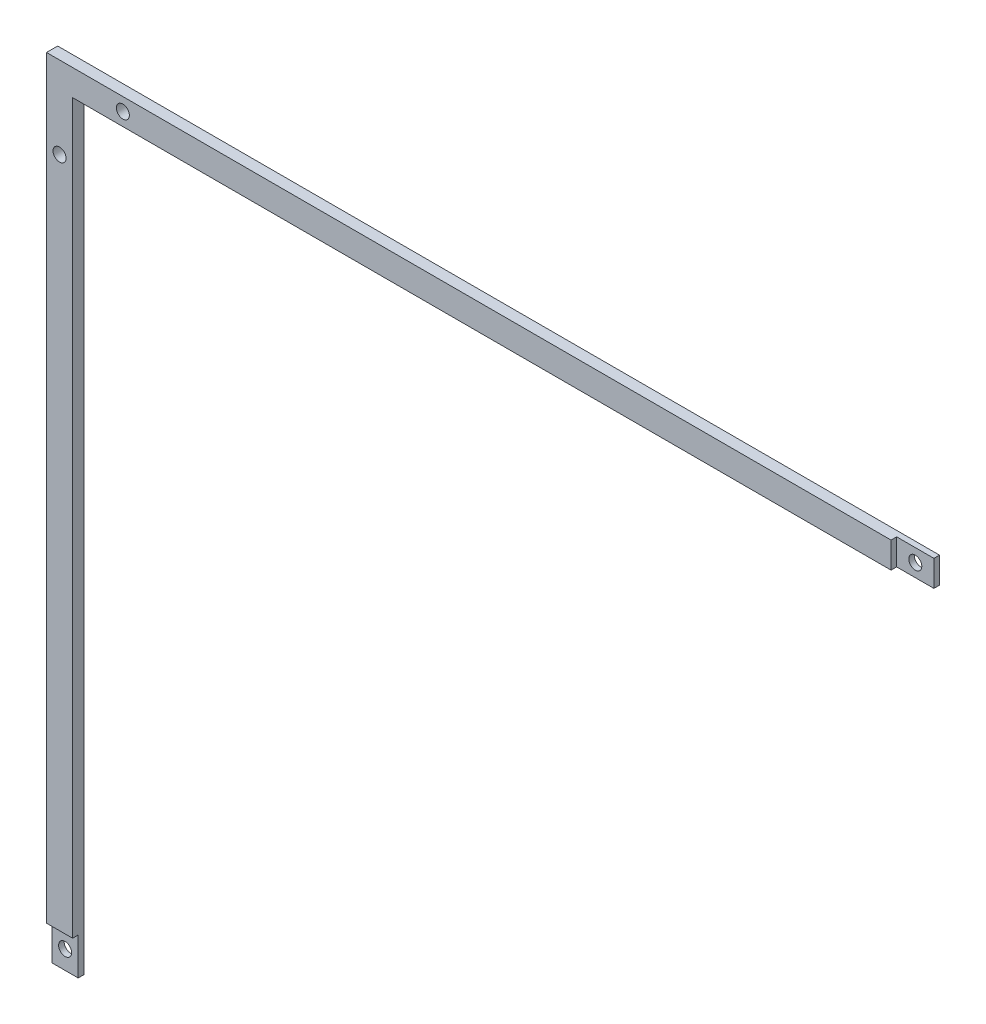
ISO-10303-21;
HEADER;
FILE_DESCRIPTION(('STEP AP214'),'2;1');
FILE_NAME('part.step','',(''),(''),'','','');
FILE_SCHEMA(('AUTOMOTIVE_DESIGN { 1 0 10303 214 1 1 1 1 }'));
ENDSEC;
DATA;
#1=APPLICATION_CONTEXT('core data for automotive mechanical design processes');
#2=APPLICATION_PROTOCOL_DEFINITION('international standard','automotive_design',2000,#1);
#3=PRODUCT_CONTEXT('',#1,'mechanical');
#4=PRODUCT('Part','Part','',(#3));
#5=PRODUCT_RELATED_PRODUCT_CATEGORY('part','',(#4));
#6=PRODUCT_DEFINITION_FORMATION('','',#4);
#7=PRODUCT_DEFINITION_CONTEXT('part definition',#1,'design');
#8=PRODUCT_DEFINITION('design','',#6,#7);
#9=PRODUCT_DEFINITION_SHAPE('','',#8);
#10=(LENGTH_UNIT() NAMED_UNIT(*) SI_UNIT(.MILLI.,.METRE.));
#11=(NAMED_UNIT(*) PLANE_ANGLE_UNIT() SI_UNIT($,.RADIAN.));
#12=(NAMED_UNIT(*) SI_UNIT($,.STERADIAN.) SOLID_ANGLE_UNIT());
#13=UNCERTAINTY_MEASURE_WITH_UNIT(LENGTH_MEASURE(1.E-05),#10,'distance_accuracy_value','');
#14=(GEOMETRIC_REPRESENTATION_CONTEXT(3) GLOBAL_UNCERTAINTY_ASSIGNED_CONTEXT((#13)) GLOBAL_UNIT_ASSIGNED_CONTEXT((#10,
#11,#12)) REPRESENTATION_CONTEXT('',''));
#15=CARTESIAN_POINT('',(0.,0.,0.));
#16=DIRECTION('',(0.,0.,1.));
#17=DIRECTION('',(1.,0.,0.));
#18=AXIS2_PLACEMENT_3D('',#15,#16,#17);
#19=CARTESIAN_POINT('',(483.811741117372,-329.480180132003,3.));
#20=DIRECTION('',(0.,1.,0.));
#21=DIRECTION('',(-1.,0.,0.));
#22=AXIS2_PLACEMENT_3D('',#19,#20,#21);
#23=PLANE('',#22);
#24=DIRECTION('',(1.,0.,0.));
#25=VECTOR('',#24,1.);
#26=CARTESIAN_POINT('',(483.811741117372,-329.480180132003,1.5));
#27=LINE('',#26,#25);
#28=CARTESIAN_POINT('',(483.811741117372,-329.480180132003,1.5));
#29=VERTEX_POINT('',#28);
#30=CARTESIAN_POINT('',(490.811741117372,-329.480180132003,1.5));
#31=VERTEX_POINT('',#30);
#32=EDGE_CURVE('E54',#29,#31,#27,.T.);
#33=ORIENTED_EDGE('',*,*,#32,.F.);
#34=DIRECTION('',(0.,0.,-1.));
#35=VECTOR('',#34,1.);
#36=CARTESIAN_POINT('',(483.811741117372,-329.480180132003,3.));
#37=LINE('',#36,#35);
#38=CARTESIAN_POINT('',(483.811741117372,-329.480180132003,0.));
#39=VERTEX_POINT('',#38);
#40=EDGE_CURVE('E47',#29,#39,#37,.T.);
#41=ORIENTED_EDGE('',*,*,#40,.T.);
#42=DIRECTION('',(1.,0.,0.));
#43=VECTOR('',#42,1.);
#44=CARTESIAN_POINT('',(483.811741117372,-329.480180132003,0.));
#45=LINE('',#44,#43);
#46=CARTESIAN_POINT('',(490.811741117372,-329.480180132003,0.));
#47=VERTEX_POINT('',#46);
#48=EDGE_CURVE('E154',#39,#47,#45,.T.);
#49=ORIENTED_EDGE('',*,*,#48,.T.);
#50=DIRECTION('',(0.,0.,-1.));
#51=VECTOR('',#50,1.);
#52=CARTESIAN_POINT('',(490.811741117372,-329.480180132003,3.));
#53=LINE('',#52,#51);
#54=EDGE_CURVE('E129',#31,#47,#53,.T.);
#55=ORIENTED_EDGE('',*,*,#54,.F.);
#56=EDGE_LOOP('',(#33,#41,#49,#55));
#57=FACE_BOUND('',#56,.T.);
#58=ADVANCED_FACE('F39',(#57),#23,.F.);
#59=CARTESIAN_POINT('',(487.311741117372,-324.480180132003,3.));
#60=DIRECTION('',(0.,0.,-1.));
#61=DIRECTION('',(-1.,0.,0.));
#62=AXIS2_PLACEMENT_3D('',#59,#60,#61);
#63=CYLINDRICAL_SURFACE('',#62,1.74999999999998);
#64=CARTESIAN_POINT('',(487.311741117372,-324.480180132003,0.));
#65=DIRECTION('',(0.,0.,1.));
#66=DIRECTION('',(1.,0.,0.));
#67=AXIS2_PLACEMENT_3D('',#64,#65,#66);
#68=CIRCLE('',#67,1.74999999999998);
#69=CARTESIAN_POINT('',(489.061741117372,-324.480180132003,0.));
#70=VERTEX_POINT('',#69);
#71=EDGE_CURVE('E178',#70,#70,#68,.T.);
#72=ORIENTED_EDGE('',*,*,#71,.F.);
#73=EDGE_LOOP('',(#72));
#74=FACE_BOUND('',#73,.T.);
#75=CARTESIAN_POINT('',(487.311741117372,-324.480180132003,1.5));
#76=DIRECTION('',(0.,0.,1.));
#77=DIRECTION('',(1.,0.,0.));
#78=AXIS2_PLACEMENT_3D('',#75,#76,#77);
#79=CIRCLE('',#78,1.74999999999998);
#80=CARTESIAN_POINT('',(489.061741117372,-324.480180132003,1.5));
#81=VERTEX_POINT('',#80);
#82=EDGE_CURVE('E190',#81,#81,#79,.T.);
#83=ORIENTED_EDGE('',*,*,#82,.T.);
#84=EDGE_LOOP('',(#83));
#85=FACE_BOUND('',#84,.T.);
#86=ADVANCED_FACE('F215',(#74,#85),#63,.F.);
#87=CARTESIAN_POINT('',(0.,0.,3.));
#88=DIRECTION('',(0.,0.,1.));
#89=DIRECTION('',(1.,0.,0.));
#90=AXIS2_PLACEMENT_3D('',#87,#88,#89);
#91=PLANE('',#90);
#92=DIRECTION('',(-1.,0.,0.));
#93=VECTOR('',#92,1.);
#94=CARTESIAN_POINT('',(490.811741117372,-319.480180132003,3.));
#95=LINE('',#94,#93);
#96=CARTESIAN_POINT('',(490.811741117372,-319.480180132003,3.));
#97=VERTEX_POINT('',#96);
#98=CARTESIAN_POINT('',(483.811741117372,-319.480180132003,3.));
#99=VERTEX_POINT('',#98);
#100=EDGE_CURVE('E123',#97,#99,#95,.T.);
#101=ORIENTED_EDGE('',*,*,#100,.F.);
#102=DIRECTION('',(0.,1.,0.));
#103=VECTOR('',#102,1.);
#104=CARTESIAN_POINT('',(490.811741117372,-329.480180132003,3.));
#105=LINE('',#104,#103);
#106=CARTESIAN_POINT('',(490.811741117373,-123.980180132003,3.));
#107=VERTEX_POINT('',#106);
#108=EDGE_CURVE('E163',#97,#107,#105,.T.);
#109=ORIENTED_EDGE('',*,*,#108,.T.);
#110=DIRECTION('',(1.,0.,0.));
#111=VECTOR('',#110,1.);
#112=CARTESIAN_POINT('',(490.811741117373,-123.980180132003,3.));
#113=LINE('',#112,#111);
#114=CARTESIAN_POINT('',(710.611741117373,-123.980180132003,3.));
#115=VERTEX_POINT('',#114);
#116=EDGE_CURVE('E144',#107,#115,#113,.T.);
#117=ORIENTED_EDGE('',*,*,#116,.T.);
#118=DIRECTION('',(0.,-1.,0.));
#119=VECTOR('',#118,1.);
#120=CARTESIAN_POINT('',(710.611741117373,-123.980180132003,3.));
#121=LINE('',#120,#119);
#122=CARTESIAN_POINT('',(710.611741117373,-116.980180132003,3.));
#123=VERTEX_POINT('',#122);
#124=EDGE_CURVE('E191',#123,#115,#121,.T.);
#125=ORIENTED_EDGE('',*,*,#124,.F.);
#126=DIRECTION('',(-1.,0.,0.));
#127=VECTOR('',#126,1.);
#128=CARTESIAN_POINT('',(720.611741117373,-116.980180132003,3.));
#129=LINE('',#128,#127);
#130=CARTESIAN_POINT('',(483.811741117372,-116.980180132003,3.));
#131=VERTEX_POINT('',#130);
#132=EDGE_CURVE('E148',#123,#131,#129,.T.);
#133=ORIENTED_EDGE('',*,*,#132,.T.);
#134=DIRECTION('',(0.,-1.,0.));
#135=VECTOR('',#134,1.);
#136=CARTESIAN_POINT('',(483.811741117372,-116.980180132003,3.));
#137=LINE('',#136,#135);
#138=EDGE_CURVE('E165',#131,#99,#137,.T.);
#139=ORIENTED_EDGE('',*,*,#138,.T.);
#140=EDGE_LOOP('',(#101,#109,#117,#125,#133,#139));
#141=FACE_BOUND('',#140,.T.);
#142=CARTESIAN_POINT('',(504.311741117373,-120.480180132003,3.));
#143=DIRECTION('',(0.,0.,1.));
#144=DIRECTION('',(1.,0.,0.));
#145=AXIS2_PLACEMENT_3D('',#142,#143,#144);
#146=CIRCLE('',#145,1.74999999999999);
#147=CARTESIAN_POINT('',(506.061741117373,-120.480180132003,3.));
#148=VERTEX_POINT('',#147);
#149=EDGE_CURVE('E160',#148,#148,#146,.T.);
#150=ORIENTED_EDGE('',*,*,#149,.F.);
#151=EDGE_LOOP('',(#150));
#152=FACE_BOUND('',#151,.T.);
#153=CARTESIAN_POINT('',(487.311741117372,-138.980180132003,3.));
#154=DIRECTION('',(0.,0.,1.));
#155=DIRECTION('',(1.,0.,0.));
#156=AXIS2_PLACEMENT_3D('',#153,#154,#155);
#157=CIRCLE('',#156,1.74999999999998);
#158=CARTESIAN_POINT('',(489.061741117372,-138.980180132003,3.));
#159=VERTEX_POINT('',#158);
#160=EDGE_CURVE('E172',#159,#159,#157,.T.);
#161=ORIENTED_EDGE('',*,*,#160,.F.);
#162=EDGE_LOOP('',(#161));
#163=FACE_BOUND('',#162,.T.);
#164=ADVANCED_FACE('F232',(#141,#152,#163),#91,.T.);
#165=CARTESIAN_POINT('',(0.,0.,0.));
#166=DIRECTION('',(0.,0.,1.));
#167=DIRECTION('',(1.,0.,0.));
#168=AXIS2_PLACEMENT_3D('',#165,#166,#167);
#169=PLANE('',#168);
#170=DIRECTION('',(-1.,0.,0.));
#171=VECTOR('',#170,1.);
#172=CARTESIAN_POINT('',(720.611741117373,-116.980180132003,0.));
#173=LINE('',#172,#171);
#174=CARTESIAN_POINT('',(720.611741117373,-116.980180132003,0.));
#175=VERTEX_POINT('',#174);
#176=CARTESIAN_POINT('',(483.811741117372,-116.980180132003,0.));
#177=VERTEX_POINT('',#176);
#178=EDGE_CURVE('E157',#175,#177,#173,.T.);
#179=ORIENTED_EDGE('',*,*,#178,.F.);
#180=DIRECTION('',(0.,1.,0.));
#181=VECTOR('',#180,1.);
#182=CARTESIAN_POINT('',(720.611741117373,-123.980180132003,0.));
#183=LINE('',#182,#181);
#184=CARTESIAN_POINT('',(720.611741117373,-123.980180132003,0.));
#185=VERTEX_POINT('',#184);
#186=EDGE_CURVE('E145',#185,#175,#183,.T.);
#187=ORIENTED_EDGE('',*,*,#186,.F.);
#188=DIRECTION('',(1.,0.,0.));
#189=VECTOR('',#188,1.);
#190=CARTESIAN_POINT('',(490.811741117373,-123.980180132003,0.));
#191=LINE('',#190,#189);
#192=CARTESIAN_POINT('',(490.811741117373,-123.980180132003,0.));
#193=VERTEX_POINT('',#192);
#194=EDGE_CURVE('E149',#193,#185,#191,.T.);
#195=ORIENTED_EDGE('',*,*,#194,.F.);
#196=DIRECTION('',(0.,1.,0.));
#197=VECTOR('',#196,1.);
#198=CARTESIAN_POINT('',(490.811741117372,-329.480180132003,0.));
#199=LINE('',#198,#197);
#200=EDGE_CURVE('E152',#47,#193,#199,.T.);
#201=ORIENTED_EDGE('',*,*,#200,.F.);
#202=ORIENTED_EDGE('',*,*,#48,.F.);
#203=DIRECTION('',(0.,-1.,0.));
#204=VECTOR('',#203,1.);
#205=CARTESIAN_POINT('',(483.811741117372,-116.980180132003,0.));
#206=LINE('',#205,#204);
#207=EDGE_CURVE('E133',#177,#39,#206,.T.);
#208=ORIENTED_EDGE('',*,*,#207,.F.);
#209=EDGE_LOOP('',(#179,#187,#195,#201,#202,#208));
#210=FACE_BOUND('',#209,.T.);
#211=CARTESIAN_POINT('',(504.311741117373,-120.480180132003,0.));
#212=DIRECTION('',(0.,0.,1.));
#213=DIRECTION('',(1.,0.,0.));
#214=AXIS2_PLACEMENT_3D('',#211,#212,#213);
#215=CIRCLE('',#214,1.74999999999999);
#216=CARTESIAN_POINT('',(506.061741117373,-120.480180132003,0.));
#217=VERTEX_POINT('',#216);
#218=EDGE_CURVE('E169',#217,#217,#215,.T.);
#219=ORIENTED_EDGE('',*,*,#218,.T.);
#220=EDGE_LOOP('',(#219));
#221=FACE_BOUND('',#220,.T.);
#222=CARTESIAN_POINT('',(487.311741117372,-138.980180132003,0.));
#223=DIRECTION('',(0.,0.,1.));
#224=DIRECTION('',(1.,0.,0.));
#225=AXIS2_PLACEMENT_3D('',#222,#223,#224);
#226=CIRCLE('',#225,1.74999999999998);
#227=CARTESIAN_POINT('',(489.061741117372,-138.980180132003,0.));
#228=VERTEX_POINT('',#227);
#229=EDGE_CURVE('E175',#228,#228,#226,.T.);
#230=ORIENTED_EDGE('',*,*,#229,.T.);
#231=EDGE_LOOP('',(#230));
#232=FACE_BOUND('',#231,.T.);
#233=ORIENTED_EDGE('',*,*,#71,.T.);
#234=EDGE_LOOP('',(#233));
#235=FACE_BOUND('',#234,.T.);
#236=CARTESIAN_POINT('',(715.611741117373,-120.480180132003,0.));
#237=DIRECTION('',(0.,0.,1.));
#238=DIRECTION('',(1.,0.,0.));
#239=AXIS2_PLACEMENT_3D('',#236,#237,#238);
#240=CIRCLE('',#239,1.74999999999999);
#241=CARTESIAN_POINT('',(717.361741117373,-120.480180132003,0.));
#242=VERTEX_POINT('',#241);
#243=EDGE_CURVE('E183',#242,#242,#240,.T.);
#244=ORIENTED_EDGE('',*,*,#243,.T.);
#245=EDGE_LOOP('',(#244));
#246=FACE_BOUND('',#245,.T.);
#247=ADVANCED_FACE('F245',(#210,#221,#232,#235,#246),#169,.F.);
#248=CARTESIAN_POINT('',(720.611741117373,-116.980180132003,3.));
#249=DIRECTION('',(0.,-1.,0.));
#250=DIRECTION('',(1.,0.,0.));
#251=AXIS2_PLACEMENT_3D('',#248,#249,#250);
#252=PLANE('',#251);
#253=ORIENTED_EDGE('',*,*,#132,.F.);
#254=DIRECTION('',(0.,0.,1.));
#255=VECTOR('',#254,1.);
#256=CARTESIAN_POINT('',(710.611741117373,-116.980180132003,1.5));
#257=LINE('',#256,#255);
#258=CARTESIAN_POINT('',(710.611741117373,-116.980180132003,1.5));
#259=VERTEX_POINT('',#258);
#260=EDGE_CURVE('E200',#259,#123,#257,.T.);
#261=ORIENTED_EDGE('',*,*,#260,.F.);
#262=DIRECTION('',(-1.,0.,0.));
#263=VECTOR('',#262,1.);
#264=CARTESIAN_POINT('',(710.611741117373,-116.980180132003,1.5));
#265=LINE('',#264,#263);
#266=CARTESIAN_POINT('',(720.611741117373,-116.980180132003,1.5));
#267=VERTEX_POINT('',#266);
#268=EDGE_CURVE('E192',#267,#259,#265,.T.);
#269=ORIENTED_EDGE('',*,*,#268,.F.);
#270=DIRECTION('',(0.,0.,-1.));
#271=VECTOR('',#270,1.);
#272=CARTESIAN_POINT('',(720.611741117373,-116.980180132003,3.));
#273=LINE('',#272,#271);
#274=EDGE_CURVE('E142',#267,#175,#273,.T.);
#275=ORIENTED_EDGE('',*,*,#274,.T.);
#276=ORIENTED_EDGE('',*,*,#178,.T.);
#277=DIRECTION('',(0.,0.,-1.));
#278=VECTOR('',#277,1.);
#279=CARTESIAN_POINT('',(483.811741117372,-116.980180132003,3.));
#280=LINE('',#279,#278);
#281=EDGE_CURVE('E11',#131,#177,#280,.T.);
#282=ORIENTED_EDGE('',*,*,#281,.F.);
#283=EDGE_LOOP('',(#253,#261,#269,#275,#276,#282));
#284=FACE_BOUND('',#283,.T.);
#285=ADVANCED_FACE('F41',(#284),#252,.F.);
#286=CARTESIAN_POINT('',(483.811741117372,-116.980180132003,3.));
#287=DIRECTION('',(1.,0.,0.));
#288=DIRECTION('',(0.,0.,-1.));
#289=AXIS2_PLACEMENT_3D('',#286,#287,#288);
#290=PLANE('',#289);
#291=DIRECTION('',(0.,-1.,0.));
#292=VECTOR('',#291,1.);
#293=CARTESIAN_POINT('',(483.811741117372,-319.480180132003,1.5));
#294=LINE('',#293,#292);
#295=CARTESIAN_POINT('',(483.811741117372,-319.480180132003,1.5));
#296=VERTEX_POINT('',#295);
#297=EDGE_CURVE('E116',#296,#29,#294,.T.);
#298=ORIENTED_EDGE('',*,*,#297,.F.);
#299=DIRECTION('',(0.,0.,1.));
#300=VECTOR('',#299,1.);
#301=CARTESIAN_POINT('',(483.811741117372,-319.480180132003,1.5));
#302=LINE('',#301,#300);
#303=EDGE_CURVE('E186',#296,#99,#302,.T.);
#304=ORIENTED_EDGE('',*,*,#303,.T.);
#305=ORIENTED_EDGE('',*,*,#138,.F.);
#306=ORIENTED_EDGE('',*,*,#281,.T.);
#307=ORIENTED_EDGE('',*,*,#207,.T.);
#308=ORIENTED_EDGE('',*,*,#40,.F.);
#309=EDGE_LOOP('',(#298,#304,#305,#306,#307,#308));
#310=FACE_BOUND('',#309,.T.);
#311=ADVANCED_FACE('F132',(#310),#290,.F.);
#312=CARTESIAN_POINT('',(490.811741117372,-329.480180132003,3.));
#313=DIRECTION('',(-1.,0.,0.));
#314=DIRECTION('',(0.,-1.,0.));
#315=AXIS2_PLACEMENT_3D('',#312,#313,#314);
#316=PLANE('',#315);
#317=ORIENTED_EDGE('',*,*,#108,.F.);
#318=DIRECTION('',(0.,0.,1.));
#319=VECTOR('',#318,1.);
#320=CARTESIAN_POINT('',(490.811741117372,-319.480180132003,1.5));
#321=LINE('',#320,#319);
#322=CARTESIAN_POINT('',(490.811741117372,-319.480180132003,1.5));
#323=VERTEX_POINT('',#322);
#324=EDGE_CURVE('E206',#323,#97,#321,.T.);
#325=ORIENTED_EDGE('',*,*,#324,.F.);
#326=DIRECTION('',(0.,1.,0.));
#327=VECTOR('',#326,1.);
#328=CARTESIAN_POINT('',(490.811741117372,-329.480180132003,1.5));
#329=LINE('',#328,#327);
#330=EDGE_CURVE('E130',#31,#323,#329,.T.);
#331=ORIENTED_EDGE('',*,*,#330,.F.);
#332=ORIENTED_EDGE('',*,*,#54,.T.);
#333=ORIENTED_EDGE('',*,*,#200,.T.);
#334=DIRECTION('',(0.,0.,-1.));
#335=VECTOR('',#334,1.);
#336=CARTESIAN_POINT('',(490.811741117373,-123.980180132003,3.));
#337=LINE('',#336,#335);
#338=EDGE_CURVE('E135',#107,#193,#337,.T.);
#339=ORIENTED_EDGE('',*,*,#338,.F.);
#340=EDGE_LOOP('',(#317,#325,#331,#332,#333,#339));
#341=FACE_BOUND('',#340,.T.);
#342=ADVANCED_FACE('F236',(#341),#316,.F.);
#343=CARTESIAN_POINT('',(490.811741117373,-123.980180132003,3.));
#344=DIRECTION('',(0.,1.,0.));
#345=DIRECTION('',(-1.,0.,0.));
#346=AXIS2_PLACEMENT_3D('',#343,#344,#345);
#347=PLANE('',#346);
#348=DIRECTION('',(1.,0.,0.));
#349=VECTOR('',#348,1.);
#350=CARTESIAN_POINT('',(720.611741117373,-123.980180132003,1.5));
#351=LINE('',#350,#349);
#352=CARTESIAN_POINT('',(710.611741117373,-123.980180132003,1.5));
#353=VERTEX_POINT('',#352);
#354=CARTESIAN_POINT('',(720.611741117373,-123.980180132003,1.5));
#355=VERTEX_POINT('',#354);
#356=EDGE_CURVE('E62',#353,#355,#351,.T.);
#357=ORIENTED_EDGE('',*,*,#356,.F.);
#358=DIRECTION('',(0.,0.,1.));
#359=VECTOR('',#358,1.);
#360=CARTESIAN_POINT('',(710.611741117373,-123.980180132003,1.5));
#361=LINE('',#360,#359);
#362=EDGE_CURVE('E202',#353,#115,#361,.T.);
#363=ORIENTED_EDGE('',*,*,#362,.T.);
#364=ORIENTED_EDGE('',*,*,#116,.F.);
#365=ORIENTED_EDGE('',*,*,#338,.T.);
#366=ORIENTED_EDGE('',*,*,#194,.T.);
#367=DIRECTION('',(0.,0.,-1.));
#368=VECTOR('',#367,1.);
#369=CARTESIAN_POINT('',(720.611741117373,-123.980180132003,3.));
#370=LINE('',#369,#368);
#371=EDGE_CURVE('E140',#355,#185,#370,.T.);
#372=ORIENTED_EDGE('',*,*,#371,.F.);
#373=EDGE_LOOP('',(#357,#363,#364,#365,#366,#372));
#374=FACE_BOUND('',#373,.T.);
#375=ADVANCED_FACE('F243',(#374),#347,.F.);
#376=CARTESIAN_POINT('',(720.611741117373,-123.980180132003,3.));
#377=DIRECTION('',(-1.,0.,0.));
#378=DIRECTION('',(0.,0.,1.));
#379=AXIS2_PLACEMENT_3D('',#376,#377,#378);
#380=PLANE('',#379);
#381=ORIENTED_EDGE('',*,*,#274,.F.);
#382=DIRECTION('',(0.,1.,0.));
#383=VECTOR('',#382,1.);
#384=CARTESIAN_POINT('',(720.611741117373,-116.980180132003,1.5));
#385=LINE('',#384,#383);
#386=EDGE_CURVE('E198',#355,#267,#385,.T.);
#387=ORIENTED_EDGE('',*,*,#386,.F.);
#388=ORIENTED_EDGE('',*,*,#371,.T.);
#389=ORIENTED_EDGE('',*,*,#186,.T.);
#390=EDGE_LOOP('',(#381,#387,#388,#389));
#391=FACE_BOUND('',#390,.T.);
#392=ADVANCED_FACE('F274',(#391),#380,.F.);
#393=CARTESIAN_POINT('',(504.311741117373,-120.480180132003,3.));
#394=DIRECTION('',(0.,0.,-1.));
#395=DIRECTION('',(-1.,0.,0.));
#396=AXIS2_PLACEMENT_3D('',#393,#394,#395);
#397=CYLINDRICAL_SURFACE('',#396,1.74999999999999);
#398=ORIENTED_EDGE('',*,*,#149,.T.);
#399=EDGE_LOOP('',(#398));
#400=FACE_BOUND('',#399,.T.);
#401=ORIENTED_EDGE('',*,*,#218,.F.);
#402=EDGE_LOOP('',(#401));
#403=FACE_BOUND('',#402,.T.);
#404=ADVANCED_FACE('F296',(#400,#403),#397,.F.);
#405=CARTESIAN_POINT('',(487.311741117372,-138.980180132003,3.));
#406=DIRECTION('',(0.,0.,-1.));
#407=DIRECTION('',(-1.,0.,0.));
#408=AXIS2_PLACEMENT_3D('',#405,#406,#407);
#409=CYLINDRICAL_SURFACE('',#408,1.74999999999998);
#410=ORIENTED_EDGE('',*,*,#160,.T.);
#411=EDGE_LOOP('',(#410));
#412=FACE_BOUND('',#411,.T.);
#413=ORIENTED_EDGE('',*,*,#229,.F.);
#414=EDGE_LOOP('',(#413));
#415=FACE_BOUND('',#414,.T.);
#416=ADVANCED_FACE('F288',(#412,#415),#409,.F.);
#417=CARTESIAN_POINT('',(715.611741117373,-120.480180132003,3.));
#418=DIRECTION('',(0.,0.,-1.));
#419=DIRECTION('',(-1.,0.,0.));
#420=AXIS2_PLACEMENT_3D('',#417,#418,#419);
#421=CYLINDRICAL_SURFACE('',#420,1.74999999999999);
#422=CARTESIAN_POINT('',(715.611741117373,-120.480180132003,1.5));
#423=DIRECTION('',(0.,0.,1.));
#424=DIRECTION('',(1.,0.,0.));
#425=AXIS2_PLACEMENT_3D('',#422,#423,#424);
#426=CIRCLE('',#425,1.74999999999999);
#427=CARTESIAN_POINT('',(717.361741117373,-120.480180132003,1.5));
#428=VERTEX_POINT('',#427);
#429=EDGE_CURVE('E187',#428,#428,#426,.T.);
#430=ORIENTED_EDGE('',*,*,#429,.T.);
#431=EDGE_LOOP('',(#430));
#432=FACE_BOUND('',#431,.T.);
#433=ORIENTED_EDGE('',*,*,#243,.F.);
#434=EDGE_LOOP('',(#433));
#435=FACE_BOUND('',#434,.T.);
#436=ADVANCED_FACE('F286',(#432,#435),#421,.F.);
#437=CARTESIAN_POINT('',(710.611741117373,-123.980180132003,1.5));
#438=DIRECTION('',(-1.,0.,0.));
#439=DIRECTION('',(0.,0.,1.));
#440=AXIS2_PLACEMENT_3D('',#437,#438,#439);
#441=PLANE('',#440);
#442=ORIENTED_EDGE('',*,*,#124,.T.);
#443=ORIENTED_EDGE('',*,*,#362,.F.);
#444=DIRECTION('',(0.,-1.,0.));
#445=VECTOR('',#444,1.);
#446=CARTESIAN_POINT('',(710.611741117373,-123.980180132003,1.5));
#447=LINE('',#446,#445);
#448=EDGE_CURVE('E195',#259,#353,#447,.T.);
#449=ORIENTED_EDGE('',*,*,#448,.F.);
#450=ORIENTED_EDGE('',*,*,#260,.T.);
#451=EDGE_LOOP('',(#442,#443,#449,#450));
#452=FACE_BOUND('',#451,.T.);
#453=ADVANCED_FACE('F271',(#452),#441,.F.);
#454=CARTESIAN_POINT('',(0.,0.,1.5));
#455=DIRECTION('',(0.,0.,-1.));
#456=DIRECTION('',(-1.,0.,0.));
#457=AXIS2_PLACEMENT_3D('',#454,#455,#456);
#458=PLANE('',#457);
#459=ORIENTED_EDGE('',*,*,#429,.F.);
#460=EDGE_LOOP('',(#459));
#461=FACE_BOUND('',#460,.T.);
#462=ORIENTED_EDGE('',*,*,#268,.T.);
#463=ORIENTED_EDGE('',*,*,#448,.T.);
#464=ORIENTED_EDGE('',*,*,#356,.T.);
#465=ORIENTED_EDGE('',*,*,#386,.T.);
#466=EDGE_LOOP('',(#462,#463,#464,#465));
#467=FACE_BOUND('',#466,.T.);
#468=ADVANCED_FACE('F223',(#461,#467),#458,.F.);
#469=CARTESIAN_POINT('',(490.811741117372,-319.480180132003,1.5));
#470=DIRECTION('',(0.,1.,0.));
#471=DIRECTION('',(0.,0.,1.));
#472=AXIS2_PLACEMENT_3D('',#469,#470,#471);
#473=PLANE('',#472);
#474=ORIENTED_EDGE('',*,*,#100,.T.);
#475=ORIENTED_EDGE('',*,*,#303,.F.);
#476=DIRECTION('',(-1.,0.,0.));
#477=VECTOR('',#476,1.);
#478=CARTESIAN_POINT('',(490.811741117372,-319.480180132003,1.5));
#479=LINE('',#478,#477);
#480=EDGE_CURVE('E119',#323,#296,#479,.T.);
#481=ORIENTED_EDGE('',*,*,#480,.F.);
#482=ORIENTED_EDGE('',*,*,#324,.T.);
#483=EDGE_LOOP('',(#474,#475,#481,#482));
#484=FACE_BOUND('',#483,.T.);
#485=ADVANCED_FACE('F218',(#484),#473,.F.);
#486=CARTESIAN_POINT('',(0.,0.,1.5));
#487=DIRECTION('',(0.,0.,1.));
#488=DIRECTION('',(1.,0.,0.));
#489=AXIS2_PLACEMENT_3D('',#486,#487,#488);
#490=PLANE('',#489);
#491=ORIENTED_EDGE('',*,*,#82,.F.);
#492=EDGE_LOOP('',(#491));
#493=FACE_BOUND('',#492,.T.);
#494=ORIENTED_EDGE('',*,*,#297,.T.);
#495=ORIENTED_EDGE('',*,*,#32,.T.);
#496=ORIENTED_EDGE('',*,*,#330,.T.);
#497=ORIENTED_EDGE('',*,*,#480,.T.);
#498=EDGE_LOOP('',(#494,#495,#496,#497));
#499=FACE_BOUND('',#498,.T.);
#500=ADVANCED_FACE('F117',(#493,#499),#490,.T.);
#501=CLOSED_SHELL('',(#58,#86,#164,#247,#285,#311,#342,#375,#392,#404,#416,#436,#453,#468,#485,#500));
#502=MANIFOLD_SOLID_BREP('B2',#501);
#503=ADVANCED_BREP_SHAPE_REPRESENTATION('',(#18,#502),#14);
#504=SHAPE_DEFINITION_REPRESENTATION(#9,#503);
ENDSEC;
END-ISO-10303-21;
